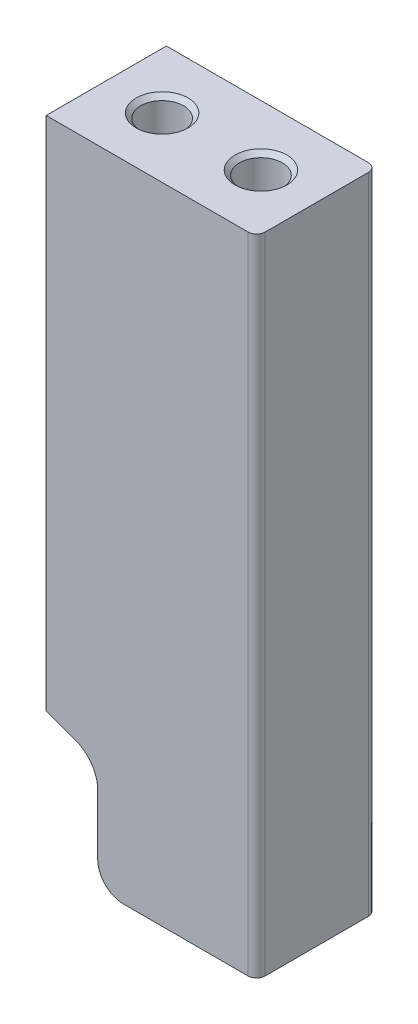
ISO-10303-21;
HEADER;
FILE_DESCRIPTION(('STEP AP214'),'2;1');
FILE_NAME('part.step','',(''),(''),'','','');
FILE_SCHEMA(('AUTOMOTIVE_DESIGN { 1 0 10303 214 1 1 1 1 }'));
ENDSEC;
DATA;
#1=APPLICATION_CONTEXT('core data for automotive mechanical design processes');
#2=APPLICATION_PROTOCOL_DEFINITION('international standard','automotive_design',2000,#1);
#3=PRODUCT_CONTEXT('',#1,'mechanical');
#4=PRODUCT('Part','Part','',(#3));
#5=PRODUCT_RELATED_PRODUCT_CATEGORY('part','',(#4));
#6=PRODUCT_DEFINITION_FORMATION('','',#4);
#7=PRODUCT_DEFINITION_CONTEXT('part definition',#1,'design');
#8=PRODUCT_DEFINITION('design','',#6,#7);
#9=PRODUCT_DEFINITION_SHAPE('','',#8);
#10=(LENGTH_UNIT() NAMED_UNIT(*) SI_UNIT(.MILLI.,.METRE.));
#11=(NAMED_UNIT(*) PLANE_ANGLE_UNIT() SI_UNIT($,.RADIAN.));
#12=(NAMED_UNIT(*) SI_UNIT($,.STERADIAN.) SOLID_ANGLE_UNIT());
#13=UNCERTAINTY_MEASURE_WITH_UNIT(LENGTH_MEASURE(1.E-05),#10,'distance_accuracy_value','');
#14=(GEOMETRIC_REPRESENTATION_CONTEXT(3) GLOBAL_UNCERTAINTY_ASSIGNED_CONTEXT((#13)) GLOBAL_UNIT_ASSIGNED_CONTEXT((#10,
#11,#12)) REPRESENTATION_CONTEXT('',''));
#15=CARTESIAN_POINT('',(0.,0.,0.));
#16=DIRECTION('',(0.,0.,1.));
#17=DIRECTION('',(1.,0.,0.));
#18=AXIS2_PLACEMENT_3D('',#15,#16,#17);
#19=CARTESIAN_POINT('',(12.25,-75.,7.));
#20=DIRECTION('',(1.,0.,0.));
#21=DIRECTION('',(0.,0.,-1.));
#22=AXIS2_PLACEMENT_3D('',#19,#20,#21);
#23=PLANE('',#22);
#24=DIRECTION('',(0.,0.,-1.));
#25=VECTOR('',#24,1.);
#26=CARTESIAN_POINT('',(12.25,-75.,7.));
#27=LINE('',#26,#25);
#28=CARTESIAN_POINT('',(12.25,-75.,6.));
#29=VERTEX_POINT('',#28);
#30=CARTESIAN_POINT('',(12.25,-75.,-6.));
#31=VERTEX_POINT('',#30);
#32=EDGE_CURVE('E185',#29,#31,#27,.T.);
#33=ORIENTED_EDGE('',*,*,#32,.T.);
#34=DIRECTION('',(0.,1.,0.));
#35=VECTOR('',#34,1.);
#36=CARTESIAN_POINT('',(12.25,-75.,-6.));
#37=LINE('',#36,#35);
#38=CARTESIAN_POINT('',(12.25,0.,-6.));
#39=VERTEX_POINT('',#38);
#40=EDGE_CURVE('E219',#31,#39,#37,.T.);
#41=ORIENTED_EDGE('',*,*,#40,.T.);
#42=DIRECTION('',(0.,0.,-1.));
#43=VECTOR('',#42,1.);
#44=CARTESIAN_POINT('',(12.25,0.,7.));
#45=LINE('',#44,#43);
#46=CARTESIAN_POINT('',(12.25,0.,6.));
#47=VERTEX_POINT('',#46);
#48=EDGE_CURVE('E180',#47,#39,#45,.T.);
#49=ORIENTED_EDGE('',*,*,#48,.F.);
#50=DIRECTION('',(0.,1.,0.));
#51=VECTOR('',#50,1.);
#52=CARTESIAN_POINT('',(12.25,-75.,6.));
#53=LINE('',#52,#51);
#54=EDGE_CURVE('E217',#47,#29,#53,.F.);
#55=ORIENTED_EDGE('',*,*,#54,.T.);
#56=EDGE_LOOP('',(#33,#41,#49,#55));
#57=FACE_BOUND('',#56,.T.);
#58=ADVANCED_FACE('F51',(#57),#23,.T.);
#59=CARTESIAN_POINT('',(-12.25,-75.,7.));
#60=DIRECTION('',(0.,0.,1.));
#61=DIRECTION('',(1.,0.,0.));
#62=AXIS2_PLACEMENT_3D('',#59,#60,#61);
#63=PLANE('',#62);
#64=DIRECTION('',(1.,0.,0.));
#65=VECTOR('',#64,1.);
#66=CARTESIAN_POINT('',(-12.25,-75.,7.));
#67=LINE('',#66,#65);
#68=CARTESIAN_POINT('',(-3.25,-75.,7.));
#69=VERTEX_POINT('',#68);
#70=CARTESIAN_POINT('',(11.25,-75.,7.));
#71=VERTEX_POINT('',#70);
#72=EDGE_CURVE('E191',#69,#71,#67,.T.);
#73=ORIENTED_EDGE('',*,*,#72,.T.);
#74=DIRECTION('',(0.,1.,0.));
#75=VECTOR('',#74,1.);
#76=CARTESIAN_POINT('',(11.25,-75.,7.));
#77=LINE('',#76,#75);
#78=CARTESIAN_POINT('',(11.25,0.,7.));
#79=VERTEX_POINT('',#78);
#80=EDGE_CURVE('E11',#71,#79,#77,.T.);
#81=ORIENTED_EDGE('',*,*,#80,.T.);
#82=DIRECTION('',(1.,0.,0.));
#83=VECTOR('',#82,1.);
#84=CARTESIAN_POINT('',(-12.25,0.,7.));
#85=LINE('',#84,#83);
#86=CARTESIAN_POINT('',(-12.25,0.,7.));
#87=VERTEX_POINT('',#86);
#88=EDGE_CURVE('E189',#87,#79,#85,.T.);
#89=ORIENTED_EDGE('',*,*,#88,.F.);
#90=DIRECTION('',(0.,1.,0.));
#91=VECTOR('',#90,1.);
#92=CARTESIAN_POINT('',(-12.25,-75.,7.));
#93=LINE('',#92,#91);
#94=CARTESIAN_POINT('',(-12.25,-60.015348441564,7.));
#95=VERTEX_POINT('',#94);
#96=EDGE_CURVE('E203',#95,#87,#93,.T.);
#97=ORIENTED_EDGE('',*,*,#96,.F.);
#98=DIRECTION('',(-0.939692620785908,0.34202014332567,0.));
#99=VECTOR('',#98,1.);
#100=CARTESIAN_POINT('',(-8.88191942669732,-61.2412295168564,7.));
#101=LINE('',#100,#99);
#102=CARTESIAN_POINT('',(-8.88191942669732,-61.2412295168564,7.));
#103=VERTEX_POINT('',#102);
#104=EDGE_CURVE('E174',#103,#95,#101,.T.);
#105=ORIENTED_EDGE('',*,*,#104,.F.);
#106=CARTESIAN_POINT('',(-10.25,-65.,7.));
#107=DIRECTION('',(0.,0.,1.));
#108=DIRECTION('',(1.,0.,0.));
#109=AXIS2_PLACEMENT_3D('',#106,#107,#108);
#110=CIRCLE('',#109,4.);
#111=CARTESIAN_POINT('',(-6.25,-65.,7.));
#112=VERTEX_POINT('',#111);
#113=EDGE_CURVE('E171',#112,#103,#110,.T.);
#114=ORIENTED_EDGE('',*,*,#113,.F.);
#115=DIRECTION('',(0.,1.,0.));
#116=VECTOR('',#115,1.);
#117=CARTESIAN_POINT('',(-6.25,-65.,7.));
#118=LINE('',#117,#116);
#119=CARTESIAN_POINT('',(-6.25,-72.,7.));
#120=VERTEX_POINT('',#119);
#121=EDGE_CURVE('E169',#120,#112,#118,.T.);
#122=ORIENTED_EDGE('',*,*,#121,.F.);
#123=CARTESIAN_POINT('',(-3.25,-72.,7.));
#124=DIRECTION('',(0.,0.,1.));
#125=DIRECTION('',(1.,0.,0.));
#126=AXIS2_PLACEMENT_3D('',#123,#124,#125);
#127=CIRCLE('',#126,3.);
#128=EDGE_CURVE('E210',#120,#69,#127,.T.);
#129=ORIENTED_EDGE('',*,*,#128,.T.);
#130=EDGE_LOOP('',(#73,#81,#89,#97,#105,#114,#122,#129));
#131=FACE_BOUND('',#130,.T.);
#132=ADVANCED_FACE('F245',(#131),#63,.T.);
#133=CARTESIAN_POINT('',(-12.25,-75.,7.));
#134=DIRECTION('',(-1.,0.,0.));
#135=DIRECTION('',(0.,0.,1.));
#136=AXIS2_PLACEMENT_3D('',#133,#134,#135);
#137=PLANE('',#136);
#138=DIRECTION('',(0.,0.,1.));
#139=VECTOR('',#138,1.);
#140=CARTESIAN_POINT('',(-12.25,-60.015348441564,-7.001));
#141=LINE('',#140,#139);
#142=CARTESIAN_POINT('',(-12.25,-60.015348441564,-7.));
#143=VERTEX_POINT('',#142);
#144=EDGE_CURVE('E177',#143,#95,#141,.T.);
#145=ORIENTED_EDGE('',*,*,#144,.T.);
#146=ORIENTED_EDGE('',*,*,#96,.T.);
#147=DIRECTION('',(0.,0.,1.));
#148=VECTOR('',#147,1.);
#149=CARTESIAN_POINT('',(-12.25,0.,7.));
#150=LINE('',#149,#148);
#151=CARTESIAN_POINT('',(-12.25,0.,-7.));
#152=VERTEX_POINT('',#151);
#153=EDGE_CURVE('E198',#152,#87,#150,.T.);
#154=ORIENTED_EDGE('',*,*,#153,.F.);
#155=DIRECTION('',(0.,1.,0.));
#156=VECTOR('',#155,1.);
#157=CARTESIAN_POINT('',(-12.25,-75.,-7.));
#158=LINE('',#157,#156);
#159=EDGE_CURVE('E193',#143,#152,#158,.T.);
#160=ORIENTED_EDGE('',*,*,#159,.F.);
#161=EDGE_LOOP('',(#145,#146,#154,#160));
#162=FACE_BOUND('',#161,.T.);
#163=ADVANCED_FACE('F241',(#162),#137,.T.);
#164=CARTESIAN_POINT('',(-12.25,-75.,-7.));
#165=DIRECTION('',(0.,0.,-1.));
#166=DIRECTION('',(-1.,0.,0.));
#167=AXIS2_PLACEMENT_3D('',#164,#165,#166);
#168=PLANE('',#167);
#169=DIRECTION('',(-1.,0.,0.));
#170=VECTOR('',#169,1.);
#171=CARTESIAN_POINT('',(-12.25,0.,-7.));
#172=LINE('',#171,#170);
#173=CARTESIAN_POINT('',(11.25,0.,-7.));
#174=VERTEX_POINT('',#173);
#175=EDGE_CURVE('E196',#174,#152,#172,.T.);
#176=ORIENTED_EDGE('',*,*,#175,.F.);
#177=DIRECTION('',(0.,1.,0.));
#178=VECTOR('',#177,1.);
#179=CARTESIAN_POINT('',(11.25,-75.,-7.));
#180=LINE('',#179,#178);
#181=CARTESIAN_POINT('',(11.25,-75.,-7.));
#182=VERTEX_POINT('',#181);
#183=EDGE_CURVE('E74',#174,#182,#180,.F.);
#184=ORIENTED_EDGE('',*,*,#183,.T.);
#185=DIRECTION('',(-1.,0.,0.));
#186=VECTOR('',#185,1.);
#187=CARTESIAN_POINT('',(-12.25,-75.,-7.));
#188=LINE('',#187,#186);
#189=CARTESIAN_POINT('',(-3.25,-75.,-7.));
#190=VERTEX_POINT('',#189);
#191=EDGE_CURVE('E188',#182,#190,#188,.T.);
#192=ORIENTED_EDGE('',*,*,#191,.T.);
#193=CARTESIAN_POINT('',(-3.25,-72.,-7.));
#194=DIRECTION('',(0.,0.,-1.));
#195=DIRECTION('',(-1.,0.,0.));
#196=AXIS2_PLACEMENT_3D('',#193,#194,#195);
#197=CIRCLE('',#196,3.);
#198=CARTESIAN_POINT('',(-6.25,-72.,-7.));
#199=VERTEX_POINT('',#198);
#200=EDGE_CURVE('E215',#190,#199,#197,.T.);
#201=ORIENTED_EDGE('',*,*,#200,.T.);
#202=DIRECTION('',(0.,1.,0.));
#203=VECTOR('',#202,1.);
#204=CARTESIAN_POINT('',(-6.25,-65.,-7.));
#205=LINE('',#204,#203);
#206=CARTESIAN_POINT('',(-6.25,-65.,-7.));
#207=VERTEX_POINT('',#206);
#208=EDGE_CURVE('E161',#199,#207,#205,.T.);
#209=ORIENTED_EDGE('',*,*,#208,.T.);
#210=CARTESIAN_POINT('',(-10.25,-65.,-7.));
#211=DIRECTION('',(0.,0.,-1.));
#212=DIRECTION('',(-1.,0.,0.));
#213=AXIS2_PLACEMENT_3D('',#210,#211,#212);
#214=CIRCLE('',#213,4.);
#215=CARTESIAN_POINT('',(-8.88191942669732,-61.2412295168564,-7.));
#216=VERTEX_POINT('',#215);
#217=EDGE_CURVE('E163',#207,#216,#214,.F.);
#218=ORIENTED_EDGE('',*,*,#217,.T.);
#219=DIRECTION('',(-0.939692620785908,0.34202014332567,0.));
#220=VECTOR('',#219,1.);
#221=CARTESIAN_POINT('',(-8.88191942669732,-61.2412295168564,-7.));
#222=LINE('',#221,#220);
#223=EDGE_CURVE('E166',#216,#143,#222,.T.);
#224=ORIENTED_EDGE('',*,*,#223,.T.);
#225=ORIENTED_EDGE('',*,*,#159,.T.);
#226=EDGE_LOOP('',(#176,#184,#192,#201,#209,#218,#224,#225));
#227=FACE_BOUND('',#226,.T.);
#228=ADVANCED_FACE('F237',(#227),#168,.T.);
#229=CARTESIAN_POINT('',(0.,-75.,0.));
#230=DIRECTION('',(0.,-1.,0.));
#231=DIRECTION('',(0.,0.,-1.));
#232=AXIS2_PLACEMENT_3D('',#229,#230,#231);
#233=PLANE('',#232);
#234=ORIENTED_EDGE('',*,*,#191,.F.);
#235=CARTESIAN_POINT('',(11.25,-75.,-6.));
#236=DIRECTION('',(0.,-1.,0.));
#237=DIRECTION('',(0.,0.,-1.));
#238=AXIS2_PLACEMENT_3D('',#235,#236,#237);
#239=CIRCLE('',#238,1.);
#240=EDGE_CURVE('E59',#182,#31,#239,.T.);
#241=ORIENTED_EDGE('',*,*,#240,.T.);
#242=ORIENTED_EDGE('',*,*,#32,.F.);
#243=CARTESIAN_POINT('',(11.25,-75.,6.));
#244=DIRECTION('',(0.,-1.,0.));
#245=DIRECTION('',(0.,0.,-1.));
#246=AXIS2_PLACEMENT_3D('',#243,#244,#245);
#247=CIRCLE('',#246,1.);
#248=EDGE_CURVE('E66',#29,#71,#247,.T.);
#249=ORIENTED_EDGE('',*,*,#248,.T.);
#250=ORIENTED_EDGE('',*,*,#72,.F.);
#251=DIRECTION('',(0.,0.,1.));
#252=VECTOR('',#251,1.);
#253=CARTESIAN_POINT('',(-3.25,-75.,-7.));
#254=LINE('',#253,#252);
#255=EDGE_CURVE('E212',#69,#190,#254,.F.);
#256=ORIENTED_EDGE('',*,*,#255,.T.);
#257=EDGE_LOOP('',(#234,#241,#242,#249,#250,#256));
#258=FACE_BOUND('',#257,.T.);
#259=ADVANCED_FACE('F228',(#258),#233,.T.);
#260=CARTESIAN_POINT('',(0.,0.,0.));
#261=DIRECTION('',(0.,-1.,0.));
#262=DIRECTION('',(0.,0.,-1.));
#263=AXIS2_PLACEMENT_3D('',#260,#261,#262);
#264=PLANE('',#263);
#265=CARTESIAN_POINT('',(-5.75,0.,0.));
#266=DIRECTION('',(0.,1.,0.));
#267=DIRECTION('',(0.,0.,1.));
#268=AXIS2_PLACEMENT_3D('',#265,#266,#267);
#269=CIRCLE('',#268,3.025);
#270=CARTESIAN_POINT('',(-5.75,0.,3.025));
#271=VERTEX_POINT('',#270);
#272=EDGE_CURVE('E152',#271,#271,#269,.T.);
#273=ORIENTED_EDGE('',*,*,#272,.F.);
#274=EDGE_LOOP('',(#273));
#275=FACE_BOUND('',#274,.T.);
#276=CARTESIAN_POINT('',(5.75,0.,0.));
#277=DIRECTION('',(0.,1.,0.));
#278=DIRECTION('',(0.,0.,1.));
#279=AXIS2_PLACEMENT_3D('',#276,#277,#278);
#280=CIRCLE('',#279,3.025);
#281=CARTESIAN_POINT('',(5.75,0.,3.025));
#282=VERTEX_POINT('',#281);
#283=EDGE_CURVE('E145',#282,#282,#280,.T.);
#284=ORIENTED_EDGE('',*,*,#283,.F.);
#285=EDGE_LOOP('',(#284));
#286=FACE_BOUND('',#285,.T.);
#287=ORIENTED_EDGE('',*,*,#48,.T.);
#288=CARTESIAN_POINT('',(11.25,0.,-6.));
#289=DIRECTION('',(0.,-1.,0.));
#290=DIRECTION('',(0.,0.,-1.));
#291=AXIS2_PLACEMENT_3D('',#288,#289,#290);
#292=CIRCLE('',#291,1.);
#293=EDGE_CURVE('E224',#39,#174,#292,.F.);
#294=ORIENTED_EDGE('',*,*,#293,.T.);
#295=ORIENTED_EDGE('',*,*,#175,.T.);
#296=ORIENTED_EDGE('',*,*,#153,.T.);
#297=ORIENTED_EDGE('',*,*,#88,.T.);
#298=CARTESIAN_POINT('',(11.25,0.,6.));
#299=DIRECTION('',(0.,-1.,0.));
#300=DIRECTION('',(0.,0.,-1.));
#301=AXIS2_PLACEMENT_3D('',#298,#299,#300);
#302=CIRCLE('',#301,1.);
#303=EDGE_CURVE('E222',#79,#47,#302,.F.);
#304=ORIENTED_EDGE('',*,*,#303,.T.);
#305=EDGE_LOOP('',(#287,#294,#295,#296,#297,#304));
#306=FACE_BOUND('',#305,.T.);
#307=ADVANCED_FACE('F236',(#275,#286,#306),#264,.F.);
#308=CARTESIAN_POINT('',(-8.88191942669732,-61.2412295168564,-7.001));
#309=DIRECTION('',(0.34202014332567,0.939692620785908,0.));
#310=DIRECTION('',(-0.939692620785908,0.34202014332567,0.));
#311=AXIS2_PLACEMENT_3D('',#308,#309,#310);
#312=PLANE('',#311);
#313=DIRECTION('',(0.,0.,1.));
#314=VECTOR('',#313,1.);
#315=CARTESIAN_POINT('',(-8.88191942669732,-61.2412295168564,-7.001));
#316=LINE('',#315,#314);
#317=EDGE_CURVE('E181',#216,#103,#316,.T.);
#318=ORIENTED_EDGE('',*,*,#317,.T.);
#319=ORIENTED_EDGE('',*,*,#104,.T.);
#320=ORIENTED_EDGE('',*,*,#144,.F.);
#321=ORIENTED_EDGE('',*,*,#223,.F.);
#322=EDGE_LOOP('',(#318,#319,#320,#321));
#323=FACE_BOUND('',#322,.T.);
#324=ADVANCED_FACE('F289',(#323),#312,.F.);
#325=CARTESIAN_POINT('',(-10.25,-65.,-7.001));
#326=DIRECTION('',(0.,0.,1.));
#327=DIRECTION('',(1.,0.,0.));
#328=AXIS2_PLACEMENT_3D('',#325,#326,#327);
#329=CYLINDRICAL_SURFACE('',#328,4.);
#330=DIRECTION('',(0.,0.,1.));
#331=VECTOR('',#330,1.);
#332=CARTESIAN_POINT('',(-6.25,-65.,-7.001));
#333=LINE('',#332,#331);
#334=EDGE_CURVE('E176',#207,#112,#333,.T.);
#335=ORIENTED_EDGE('',*,*,#334,.T.);
#336=ORIENTED_EDGE('',*,*,#113,.T.);
#337=ORIENTED_EDGE('',*,*,#317,.F.);
#338=ORIENTED_EDGE('',*,*,#217,.F.);
#339=EDGE_LOOP('',(#335,#336,#337,#338));
#340=FACE_BOUND('',#339,.T.);
#341=ADVANCED_FACE('F275',(#340),#329,.F.);
#342=CARTESIAN_POINT('',(-6.25,-65.,-7.001));
#343=DIRECTION('',(1.,0.,0.));
#344=DIRECTION('',(0.,1.,0.));
#345=AXIS2_PLACEMENT_3D('',#342,#343,#344);
#346=PLANE('',#345);
#347=ORIENTED_EDGE('',*,*,#208,.F.);
#348=DIRECTION('',(0.,0.,1.));
#349=VECTOR('',#348,1.);
#350=CARTESIAN_POINT('',(-6.25,-72.,7.));
#351=LINE('',#350,#349);
#352=EDGE_CURVE('E205',#199,#120,#351,.T.);
#353=ORIENTED_EDGE('',*,*,#352,.T.);
#354=ORIENTED_EDGE('',*,*,#121,.T.);
#355=ORIENTED_EDGE('',*,*,#334,.F.);
#356=EDGE_LOOP('',(#347,#353,#354,#355));
#357=FACE_BOUND('',#356,.T.);
#358=ADVANCED_FACE('F270',(#357),#346,.F.);
#359=CARTESIAN_POINT('',(-3.25,-72.,-7.001));
#360=DIRECTION('',(0.,0.,-1.));
#361=DIRECTION('',(-1.,0.,0.));
#362=AXIS2_PLACEMENT_3D('',#359,#360,#361);
#363=CYLINDRICAL_SURFACE('',#362,3.);
#364=ORIENTED_EDGE('',*,*,#200,.F.);
#365=ORIENTED_EDGE('',*,*,#255,.F.);
#366=ORIENTED_EDGE('',*,*,#128,.F.);
#367=ORIENTED_EDGE('',*,*,#352,.F.);
#368=EDGE_LOOP('',(#364,#365,#366,#367));
#369=FACE_BOUND('',#368,.T.);
#370=ADVANCED_FACE('F259',(#369),#363,.T.);
#371=CARTESIAN_POINT('',(11.25,-75.,-6.));
#372=DIRECTION('',(0.,1.,0.));
#373=DIRECTION('',(0.,0.,1.));
#374=AXIS2_PLACEMENT_3D('',#371,#372,#373);
#375=CYLINDRICAL_SURFACE('',#374,1.);
#376=ORIENTED_EDGE('',*,*,#240,.F.);
#377=ORIENTED_EDGE('',*,*,#183,.F.);
#378=ORIENTED_EDGE('',*,*,#293,.F.);
#379=ORIENTED_EDGE('',*,*,#40,.F.);
#380=EDGE_LOOP('',(#376,#377,#378,#379));
#381=FACE_BOUND('',#380,.T.);
#382=ADVANCED_FACE('F234',(#381),#375,.T.);
#383=CARTESIAN_POINT('',(11.25,-75.,6.));
#384=DIRECTION('',(0.,1.,0.));
#385=DIRECTION('',(0.,0.,1.));
#386=AXIS2_PLACEMENT_3D('',#383,#384,#385);
#387=CYLINDRICAL_SURFACE('',#386,1.);
#388=ORIENTED_EDGE('',*,*,#248,.F.);
#389=ORIENTED_EDGE('',*,*,#54,.F.);
#390=ORIENTED_EDGE('',*,*,#303,.F.);
#391=ORIENTED_EDGE('',*,*,#80,.F.);
#392=EDGE_LOOP('',(#388,#389,#390,#391));
#393=FACE_BOUND('',#392,.T.);
#394=ADVANCED_FACE('F53',(#393),#387,.T.);
#395=CARTESIAN_POINT('',(5.75,-17.,0.));
#396=DIRECTION('',(0.,1.,0.));
#397=DIRECTION('',(0.,0.,1.));
#398=AXIS2_PLACEMENT_3D('',#395,#396,#397);
#399=CONICAL_SURFACE('',#398,2.49999999999999,1.02974425867665);
#400=CARTESIAN_POINT('',(5.74999999999999,-18.5021515475689,0.));
#401=VERTEX_POINT('',#400);
#402=VERTEX_LOOP('',#401);
#403=FACE_BOUND('',#402,.T.);
#404=CARTESIAN_POINT('',(5.75,-17.,0.));
#405=DIRECTION('',(0.,1.,0.));
#406=DIRECTION('',(0.,0.,1.));
#407=AXIS2_PLACEMENT_3D('',#404,#405,#406);
#408=CIRCLE('',#407,2.49999999999999);
#409=CARTESIAN_POINT('',(5.75,-17.,2.49999999999999));
#410=VERTEX_POINT('',#409);
#411=EDGE_CURVE('E158',#410,#410,#408,.T.);
#412=ORIENTED_EDGE('',*,*,#411,.T.);
#413=EDGE_LOOP('',(#412));
#414=FACE_BOUND('',#413,.T.);
#415=ADVANCED_FACE('F250',(#403,#414),#399,.F.);
#416=CARTESIAN_POINT('',(5.75,0.,0.));
#417=DIRECTION('',(0.,1.,0.));
#418=DIRECTION('',(0.,0.,1.));
#419=AXIS2_PLACEMENT_3D('',#416,#417,#418);
#420=CYLINDRICAL_SURFACE('',#419,2.49999999999999);
#421=ORIENTED_EDGE('',*,*,#411,.F.);
#422=EDGE_LOOP('',(#421));
#423=FACE_BOUND('',#422,.T.);
#424=CARTESIAN_POINT('',(5.75,-0.524999999999998,0.));
#425=DIRECTION('',(0.,1.,0.));
#426=DIRECTION('',(0.,0.,1.));
#427=AXIS2_PLACEMENT_3D('',#424,#425,#426);
#428=CIRCLE('',#427,2.5);
#429=CARTESIAN_POINT('',(5.75,-0.524999999999998,2.5));
#430=VERTEX_POINT('',#429);
#431=EDGE_CURVE('E149',#430,#430,#428,.T.);
#432=ORIENTED_EDGE('',*,*,#431,.T.);
#433=EDGE_LOOP('',(#432));
#434=FACE_BOUND('',#433,.T.);
#435=ADVANCED_FACE('F256',(#423,#434),#420,.F.);
#436=CARTESIAN_POINT('',(5.75,0.,0.));
#437=DIRECTION('',(0.,1.,0.));
#438=DIRECTION('',(0.,0.,1.));
#439=AXIS2_PLACEMENT_3D('',#436,#437,#438);
#440=CONICAL_SURFACE('',#439,3.025,0.785398163397452);
#441=ORIENTED_EDGE('',*,*,#431,.F.);
#442=EDGE_LOOP('',(#441));
#443=FACE_BOUND('',#442,.T.);
#444=ORIENTED_EDGE('',*,*,#283,.T.);
#445=EDGE_LOOP('',(#444));
#446=FACE_BOUND('',#445,.T.);
#447=ADVANCED_FACE('F139',(#443,#446),#440,.F.);
#448=CARTESIAN_POINT('',(-5.75,-17.,0.));
#449=DIRECTION('',(0.,1.,0.));
#450=DIRECTION('',(0.,0.,1.));
#451=AXIS2_PLACEMENT_3D('',#448,#449,#450);
#452=CONICAL_SURFACE('',#451,2.49999999999999,1.02974425867665);
#453=CARTESIAN_POINT('',(-5.75000000000001,-18.5021515475689,0.));
#454=VERTEX_POINT('',#453);
#455=VERTEX_LOOP('',#454);
#456=FACE_BOUND('',#455,.T.);
#457=CARTESIAN_POINT('',(-5.75,-17.,0.));
#458=DIRECTION('',(0.,1.,0.));
#459=DIRECTION('',(0.,0.,1.));
#460=AXIS2_PLACEMENT_3D('',#457,#458,#459);
#461=CIRCLE('',#460,2.49999999999999);
#462=CARTESIAN_POINT('',(-5.75,-17.,2.49999999999999));
#463=VERTEX_POINT('',#462);
#464=EDGE_CURVE('E143',#463,#463,#461,.T.);
#465=ORIENTED_EDGE('',*,*,#464,.T.);
#466=EDGE_LOOP('',(#465));
#467=FACE_BOUND('',#466,.T.);
#468=ADVANCED_FACE('F135',(#456,#467),#452,.F.);
#469=CARTESIAN_POINT('',(-5.75,0.,0.));
#470=DIRECTION('',(0.,1.,0.));
#471=DIRECTION('',(0.,0.,1.));
#472=AXIS2_PLACEMENT_3D('',#469,#470,#471);
#473=CYLINDRICAL_SURFACE('',#472,2.49999999999999);
#474=ORIENTED_EDGE('',*,*,#464,.F.);
#475=EDGE_LOOP('',(#474));
#476=FACE_BOUND('',#475,.T.);
#477=CARTESIAN_POINT('',(-5.75,-0.524999999999998,0.));
#478=DIRECTION('',(0.,1.,0.));
#479=DIRECTION('',(0.,0.,1.));
#480=AXIS2_PLACEMENT_3D('',#477,#478,#479);
#481=CIRCLE('',#480,2.5);
#482=CARTESIAN_POINT('',(-5.75,-0.524999999999998,2.5));
#483=VERTEX_POINT('',#482);
#484=EDGE_CURVE('E146',#483,#483,#481,.T.);
#485=ORIENTED_EDGE('',*,*,#484,.T.);
#486=EDGE_LOOP('',(#485));
#487=FACE_BOUND('',#486,.T.);
#488=ADVANCED_FACE('F138',(#476,#487),#473,.F.);
#489=CARTESIAN_POINT('',(-5.75,0.,0.));
#490=DIRECTION('',(0.,1.,0.));
#491=DIRECTION('',(0.,0.,1.));
#492=AXIS2_PLACEMENT_3D('',#489,#490,#491);
#493=CONICAL_SURFACE('',#492,3.025,0.78539816339745);
#494=ORIENTED_EDGE('',*,*,#484,.F.);
#495=EDGE_LOOP('',(#494));
#496=FACE_BOUND('',#495,.T.);
#497=ORIENTED_EDGE('',*,*,#272,.T.);
#498=EDGE_LOOP('',(#497));
#499=FACE_BOUND('',#498,.T.);
#500=ADVANCED_FACE('F371',(#496,#499),#493,.F.);
#501=CLOSED_SHELL('',(#58,#132,#163,#228,#259,#307,#324,#341,#358,#370,#382,#394,#415,#435,#447,
#468,#488,#500));
#502=MANIFOLD_SOLID_BREP('B2',#501);
#503=ADVANCED_BREP_SHAPE_REPRESENTATION('',(#18,#502),#14);
#504=SHAPE_DEFINITION_REPRESENTATION(#9,#503);
ENDSEC;
END-ISO-10303-21;
